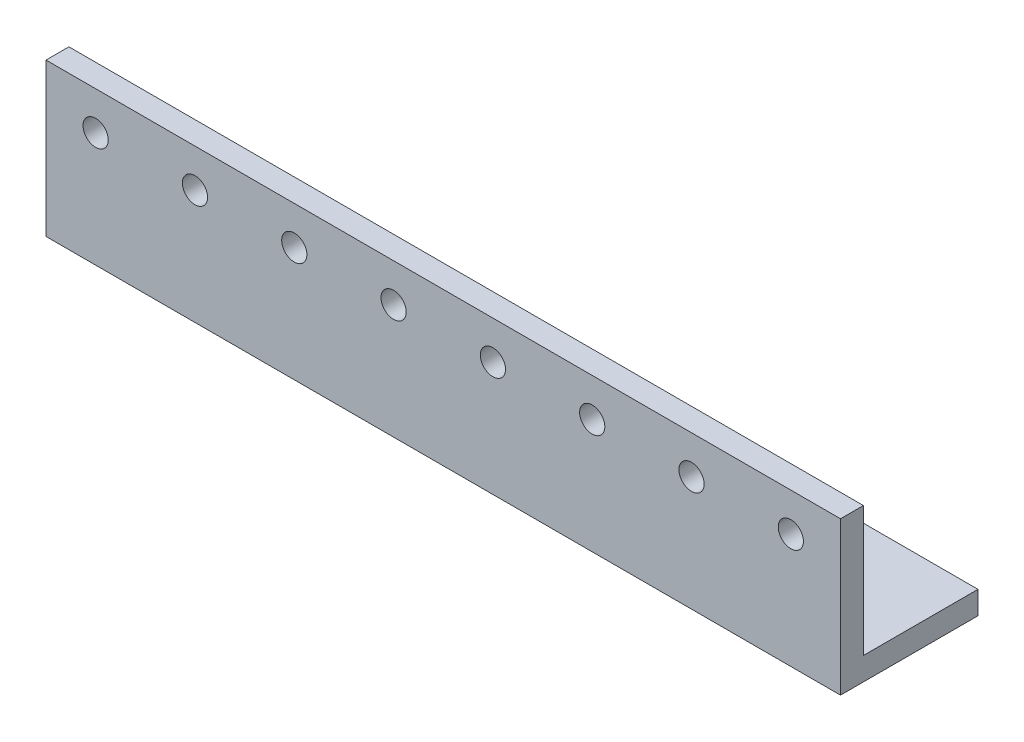
ISO-10303-21;
HEADER;
FILE_DESCRIPTION(('STEP AP214'),'2;1');
FILE_NAME('part.step','',(''),(''),'','','');
FILE_SCHEMA(('AUTOMOTIVE_DESIGN { 1 0 10303 214 1 1 1 1 }'));
ENDSEC;
DATA;
#1=APPLICATION_CONTEXT('core data for automotive mechanical design processes');
#2=APPLICATION_PROTOCOL_DEFINITION('international standard','automotive_design',2000,#1);
#3=PRODUCT_CONTEXT('',#1,'mechanical');
#4=PRODUCT('Part','Part','',(#3));
#5=PRODUCT_RELATED_PRODUCT_CATEGORY('part','',(#4));
#6=PRODUCT_DEFINITION_FORMATION('','',#4);
#7=PRODUCT_DEFINITION_CONTEXT('part definition',#1,'design');
#8=PRODUCT_DEFINITION('design','',#6,#7);
#9=PRODUCT_DEFINITION_SHAPE('','',#8);
#10=(LENGTH_UNIT() NAMED_UNIT(*) SI_UNIT(.MILLI.,.METRE.));
#11=(NAMED_UNIT(*) PLANE_ANGLE_UNIT() SI_UNIT($,.RADIAN.));
#12=(NAMED_UNIT(*) SI_UNIT($,.STERADIAN.) SOLID_ANGLE_UNIT());
#13=UNCERTAINTY_MEASURE_WITH_UNIT(LENGTH_MEASURE(1.E-05),#10,'distance_accuracy_value','');
#14=(GEOMETRIC_REPRESENTATION_CONTEXT(3) GLOBAL_UNCERTAINTY_ASSIGNED_CONTEXT((#13)) GLOBAL_UNIT_ASSIGNED_CONTEXT((#10,
#11,#12)) REPRESENTATION_CONTEXT('',''));
#15=CARTESIAN_POINT('',(0.,0.,0.));
#16=DIRECTION('',(0.,0.,1.));
#17=DIRECTION('',(1.,0.,0.));
#18=AXIS2_PLACEMENT_3D('',#15,#16,#17);
#19=CARTESIAN_POINT('',(52.,-17.,-15.));
#20=DIRECTION('',(0.,-1.,0.));
#21=DIRECTION('',(0.,0.,-1.));
#22=AXIS2_PLACEMENT_3D('',#19,#20,#21);
#23=PLANE('',#22);
#24=CARTESIAN_POINT('',(0.,-17.,-7.5));
#25=DIRECTION('',(0.,1.,0.));
#26=DIRECTION('',(0.,0.,1.));
#27=AXIS2_PLACEMENT_3D('',#24,#25,#26);
#28=CIRCLE('',#27,4.8895);
#29=CARTESIAN_POINT('',(0.,-17.,-2.6105));
#30=VERTEX_POINT('',#29);
#31=EDGE_CURVE('E214',#30,#30,#28,.T.);
#32=ORIENTED_EDGE('',*,*,#31,.F.);
#33=EDGE_LOOP('',(#32));
#34=FACE_BOUND('',#33,.T.);
#35=CARTESIAN_POINT('',(-37.5,-17.,-7.5));
#36=DIRECTION('',(0.,1.,0.));
#37=DIRECTION('',(0.,0.,1.));
#38=AXIS2_PLACEMENT_3D('',#35,#36,#37);
#39=CIRCLE('',#38,4.8895);
#40=CARTESIAN_POINT('',(-37.5,-17.,-2.6105));
#41=VERTEX_POINT('',#40);
#42=EDGE_CURVE('E223',#41,#41,#39,.T.);
#43=ORIENTED_EDGE('',*,*,#42,.F.);
#44=EDGE_LOOP('',(#43));
#45=FACE_BOUND('',#44,.T.);
#46=DIRECTION('',(1.,0.,0.));
#47=VECTOR('',#46,1.);
#48=CARTESIAN_POINT('',(52.,-17.,0.));
#49=LINE('',#48,#47);
#50=CARTESIAN_POINT('',(-52.,-17.,0.));
#51=VERTEX_POINT('',#50);
#52=CARTESIAN_POINT('',(52.,-17.,0.));
#53=VERTEX_POINT('',#52);
#54=EDGE_CURVE('E50',#51,#53,#49,.T.);
#55=ORIENTED_EDGE('',*,*,#54,.T.);
#56=DIRECTION('',(0.,0.,1.));
#57=VECTOR('',#56,1.);
#58=CARTESIAN_POINT('',(52.,-17.,-15.));
#59=LINE('',#58,#57);
#60=CARTESIAN_POINT('',(52.,-17.,-15.));
#61=VERTEX_POINT('',#60);
#62=EDGE_CURVE('E124',#61,#53,#59,.T.);
#63=ORIENTED_EDGE('',*,*,#62,.F.);
#64=DIRECTION('',(1.,0.,0.));
#65=VECTOR('',#64,1.);
#66=CARTESIAN_POINT('',(52.,-17.,-15.));
#67=LINE('',#66,#65);
#68=CARTESIAN_POINT('',(-52.,-17.,-15.));
#69=VERTEX_POINT('',#68);
#70=EDGE_CURVE('E115',#69,#61,#67,.T.);
#71=ORIENTED_EDGE('',*,*,#70,.F.);
#72=DIRECTION('',(0.,0.,1.));
#73=VECTOR('',#72,1.);
#74=CARTESIAN_POINT('',(-52.,-17.,-15.));
#75=LINE('',#74,#73);
#76=EDGE_CURVE('E127',#69,#51,#75,.T.);
#77=ORIENTED_EDGE('',*,*,#76,.T.);
#78=EDGE_LOOP('',(#55,#63,#71,#77));
#79=FACE_BOUND('',#78,.T.);
#80=CARTESIAN_POINT('',(37.5,-17.,-7.5));
#81=DIRECTION('',(0.,1.,0.));
#82=DIRECTION('',(0.,0.,1.));
#83=AXIS2_PLACEMENT_3D('',#80,#81,#82);
#84=CIRCLE('',#83,4.8895);
#85=CARTESIAN_POINT('',(37.5,-17.,-2.6105));
#86=VERTEX_POINT('',#85);
#87=EDGE_CURVE('E204',#86,#86,#84,.T.);
#88=ORIENTED_EDGE('',*,*,#87,.F.);
#89=EDGE_LOOP('',(#88));
#90=FACE_BOUND('',#89,.T.);
#91=ADVANCED_FACE('F35',(#34,#45,#79,#90),#23,.F.);
#92=CARTESIAN_POINT('',(0.,0.,3.));
#93=DIRECTION('',(0.,0.,-1.));
#94=DIRECTION('',(-1.,0.,0.));
#95=AXIS2_PLACEMENT_3D('',#92,#93,#94);
#96=PLANE('',#95);
#97=CARTESIAN_POINT('',(-45.5,-4.99999999999999,3.));
#98=DIRECTION('',(0.,0.,1.));
#99=DIRECTION('',(1.,0.,0.));
#100=AXIS2_PLACEMENT_3D('',#97,#98,#99);
#101=CIRCLE('',#100,1.65);
#102=CARTESIAN_POINT('',(-43.85,-4.99999999999999,3.));
#103=VERTEX_POINT('',#102);
#104=EDGE_CURVE('E130',#103,#103,#101,.T.);
#105=ORIENTED_EDGE('',*,*,#104,.F.);
#106=EDGE_LOOP('',(#105));
#107=FACE_BOUND('',#106,.T.);
#108=CARTESIAN_POINT('',(45.5,-5.00000000000001,3.));
#109=DIRECTION('',(0.,0.,1.));
#110=DIRECTION('',(1.,0.,0.));
#111=AXIS2_PLACEMENT_3D('',#108,#109,#110);
#112=CIRCLE('',#111,1.65);
#113=CARTESIAN_POINT('',(47.15,-5.00000000000001,3.));
#114=VERTEX_POINT('',#113);
#115=EDGE_CURVE('E136',#114,#114,#112,.T.);
#116=ORIENTED_EDGE('',*,*,#115,.F.);
#117=EDGE_LOOP('',(#116));
#118=FACE_BOUND('',#117,.T.);
#119=CARTESIAN_POINT('',(-19.5,-5.,3.));
#120=DIRECTION('',(0.,0.,1.));
#121=DIRECTION('',(1.,0.,0.));
#122=AXIS2_PLACEMENT_3D('',#119,#120,#121);
#123=CIRCLE('',#122,1.65);
#124=CARTESIAN_POINT('',(-17.85,-5.,3.));
#125=VERTEX_POINT('',#124);
#126=EDGE_CURVE('E148',#125,#125,#123,.T.);
#127=ORIENTED_EDGE('',*,*,#126,.F.);
#128=EDGE_LOOP('',(#127));
#129=FACE_BOUND('',#128,.T.);
#130=CARTESIAN_POINT('',(-6.5,-5.,3.));
#131=DIRECTION('',(0.,0.,1.));
#132=DIRECTION('',(1.,0.,0.));
#133=AXIS2_PLACEMENT_3D('',#130,#131,#132);
#134=CIRCLE('',#133,1.65);
#135=CARTESIAN_POINT('',(-4.85,-5.,3.));
#136=VERTEX_POINT('',#135);
#137=EDGE_CURVE('E154',#136,#136,#134,.T.);
#138=ORIENTED_EDGE('',*,*,#137,.F.);
#139=EDGE_LOOP('',(#138));
#140=FACE_BOUND('',#139,.T.);
#141=CARTESIAN_POINT('',(6.5,-5.,3.));
#142=DIRECTION('',(0.,0.,1.));
#143=DIRECTION('',(1.,0.,0.));
#144=AXIS2_PLACEMENT_3D('',#141,#142,#143);
#145=CIRCLE('',#144,1.65);
#146=CARTESIAN_POINT('',(8.15,-5.,3.));
#147=VERTEX_POINT('',#146);
#148=EDGE_CURVE('E160',#147,#147,#145,.T.);
#149=ORIENTED_EDGE('',*,*,#148,.F.);
#150=EDGE_LOOP('',(#149));
#151=FACE_BOUND('',#150,.T.);
#152=CARTESIAN_POINT('',(19.5,-5.,3.));
#153=DIRECTION('',(0.,0.,1.));
#154=DIRECTION('',(1.,0.,0.));
#155=AXIS2_PLACEMENT_3D('',#152,#153,#154);
#156=CIRCLE('',#155,1.65);
#157=CARTESIAN_POINT('',(21.15,-5.,3.));
#158=VERTEX_POINT('',#157);
#159=EDGE_CURVE('E166',#158,#158,#156,.T.);
#160=ORIENTED_EDGE('',*,*,#159,.F.);
#161=EDGE_LOOP('',(#160));
#162=FACE_BOUND('',#161,.T.);
#163=CARTESIAN_POINT('',(32.5,-5.00000000000001,3.));
#164=DIRECTION('',(0.,0.,1.));
#165=DIRECTION('',(1.,0.,0.));
#166=AXIS2_PLACEMENT_3D('',#163,#164,#165);
#167=CIRCLE('',#166,1.65);
#168=CARTESIAN_POINT('',(34.15,-5.00000000000001,3.));
#169=VERTEX_POINT('',#168);
#170=EDGE_CURVE('E172',#169,#169,#167,.T.);
#171=ORIENTED_EDGE('',*,*,#170,.F.);
#172=EDGE_LOOP('',(#171));
#173=FACE_BOUND('',#172,.T.);
#174=DIRECTION('',(0.,-1.,0.));
#175=VECTOR('',#174,1.);
#176=CARTESIAN_POINT('',(-52.,-20.,3.));
#177=LINE('',#176,#175);
#178=CARTESIAN_POINT('',(-52.,0.,3.));
#179=VERTEX_POINT('',#178);
#180=CARTESIAN_POINT('',(-52.,-20.,3.));
#181=VERTEX_POINT('',#180);
#182=EDGE_CURVE('E179',#179,#181,#177,.T.);
#183=ORIENTED_EDGE('',*,*,#182,.T.);
#184=DIRECTION('',(1.,0.,0.));
#185=VECTOR('',#184,1.);
#186=CARTESIAN_POINT('',(-52.,-20.,3.));
#187=LINE('',#186,#185);
#188=CARTESIAN_POINT('',(52.,-20.,3.));
#189=VERTEX_POINT('',#188);
#190=EDGE_CURVE('E81',#181,#189,#187,.T.);
#191=ORIENTED_EDGE('',*,*,#190,.T.);
#192=DIRECTION('',(0.,1.,0.));
#193=VECTOR('',#192,1.);
#194=CARTESIAN_POINT('',(52.,-20.,3.));
#195=LINE('',#194,#193);
#196=CARTESIAN_POINT('',(52.,0.,3.));
#197=VERTEX_POINT('',#196);
#198=EDGE_CURVE('E103',#189,#197,#195,.T.);
#199=ORIENTED_EDGE('',*,*,#198,.T.);
#200=DIRECTION('',(-1.,0.,0.));
#201=VECTOR('',#200,1.);
#202=CARTESIAN_POINT('',(-52.,0.,3.));
#203=LINE('',#202,#201);
#204=EDGE_CURVE('E59',#197,#179,#203,.T.);
#205=ORIENTED_EDGE('',*,*,#204,.T.);
#206=EDGE_LOOP('',(#183,#191,#199,#205));
#207=FACE_BOUND('',#206,.T.);
#208=CARTESIAN_POINT('',(-32.5,-4.99999999999999,3.));
#209=DIRECTION('',(0.,0.,1.));
#210=DIRECTION('',(1.,0.,0.));
#211=AXIS2_PLACEMENT_3D('',#208,#209,#210);
#212=CIRCLE('',#211,1.65);
#213=CARTESIAN_POINT('',(-30.85,-4.99999999999999,3.));
#214=VERTEX_POINT('',#213);
#215=EDGE_CURVE('E142',#214,#214,#212,.T.);
#216=ORIENTED_EDGE('',*,*,#215,.F.);
#217=EDGE_LOOP('',(#216));
#218=FACE_BOUND('',#217,.T.);
#219=ADVANCED_FACE('F199',(#107,#118,#129,#140,#151,#162,#173,#207,#218),#96,.F.);
#220=CARTESIAN_POINT('',(0.,0.,0.));
#221=DIRECTION('',(0.,0.,-1.));
#222=DIRECTION('',(-1.,0.,0.));
#223=AXIS2_PLACEMENT_3D('',#220,#221,#222);
#224=PLANE('',#223);
#225=ORIENTED_EDGE('',*,*,#54,.F.);
#226=DIRECTION('',(0.,-1.,0.));
#227=VECTOR('',#226,1.);
#228=CARTESIAN_POINT('',(-52.,-20.,0.));
#229=LINE('',#228,#227);
#230=CARTESIAN_POINT('',(-52.,0.,0.));
#231=VERTEX_POINT('',#230);
#232=EDGE_CURVE('E178',#231,#51,#229,.T.);
#233=ORIENTED_EDGE('',*,*,#232,.F.);
#234=DIRECTION('',(-1.,0.,0.));
#235=VECTOR('',#234,1.);
#236=CARTESIAN_POINT('',(-52.,0.,0.));
#237=LINE('',#236,#235);
#238=CARTESIAN_POINT('',(52.,0.,0.));
#239=VERTEX_POINT('',#238);
#240=EDGE_CURVE('E74',#239,#231,#237,.T.);
#241=ORIENTED_EDGE('',*,*,#240,.F.);
#242=DIRECTION('',(0.,1.,0.));
#243=VECTOR('',#242,1.);
#244=CARTESIAN_POINT('',(52.,-20.,0.));
#245=LINE('',#244,#243);
#246=EDGE_CURVE('E186',#53,#239,#245,.T.);
#247=ORIENTED_EDGE('',*,*,#246,.F.);
#248=EDGE_LOOP('',(#225,#233,#241,#247));
#249=FACE_BOUND('',#248,.T.);
#250=CARTESIAN_POINT('',(-45.5,-4.99999999999999,0.));
#251=DIRECTION('',(0.,0.,1.));
#252=DIRECTION('',(1.,0.,0.));
#253=AXIS2_PLACEMENT_3D('',#250,#251,#252);
#254=CIRCLE('',#253,1.65);
#255=CARTESIAN_POINT('',(-43.85,-4.99999999999999,0.));
#256=VERTEX_POINT('',#255);
#257=EDGE_CURVE('E133',#256,#256,#254,.T.);
#258=ORIENTED_EDGE('',*,*,#257,.T.);
#259=EDGE_LOOP('',(#258));
#260=FACE_BOUND('',#259,.T.);
#261=CARTESIAN_POINT('',(45.5,-5.00000000000001,0.));
#262=DIRECTION('',(0.,0.,1.));
#263=DIRECTION('',(1.,0.,0.));
#264=AXIS2_PLACEMENT_3D('',#261,#262,#263);
#265=CIRCLE('',#264,1.65);
#266=CARTESIAN_POINT('',(47.15,-5.00000000000001,0.));
#267=VERTEX_POINT('',#266);
#268=EDGE_CURVE('E139',#267,#267,#265,.T.);
#269=ORIENTED_EDGE('',*,*,#268,.T.);
#270=EDGE_LOOP('',(#269));
#271=FACE_BOUND('',#270,.T.);
#272=CARTESIAN_POINT('',(-32.5,-4.99999999999999,0.));
#273=DIRECTION('',(0.,0.,1.));
#274=DIRECTION('',(1.,0.,0.));
#275=AXIS2_PLACEMENT_3D('',#272,#273,#274);
#276=CIRCLE('',#275,1.65);
#277=CARTESIAN_POINT('',(-30.85,-4.99999999999999,0.));
#278=VERTEX_POINT('',#277);
#279=EDGE_CURVE('E145',#278,#278,#276,.T.);
#280=ORIENTED_EDGE('',*,*,#279,.T.);
#281=EDGE_LOOP('',(#280));
#282=FACE_BOUND('',#281,.T.);
#283=CARTESIAN_POINT('',(-19.5,-5.,0.));
#284=DIRECTION('',(0.,0.,1.));
#285=DIRECTION('',(1.,0.,0.));
#286=AXIS2_PLACEMENT_3D('',#283,#284,#285);
#287=CIRCLE('',#286,1.65);
#288=CARTESIAN_POINT('',(-17.85,-5.,0.));
#289=VERTEX_POINT('',#288);
#290=EDGE_CURVE('E151',#289,#289,#287,.T.);
#291=ORIENTED_EDGE('',*,*,#290,.T.);
#292=EDGE_LOOP('',(#291));
#293=FACE_BOUND('',#292,.T.);
#294=CARTESIAN_POINT('',(32.5,-5.00000000000001,0.));
#295=DIRECTION('',(0.,0.,1.));
#296=DIRECTION('',(1.,0.,0.));
#297=AXIS2_PLACEMENT_3D('',#294,#295,#296);
#298=CIRCLE('',#297,1.65);
#299=CARTESIAN_POINT('',(34.15,-5.00000000000001,0.));
#300=VERTEX_POINT('',#299);
#301=EDGE_CURVE('E175',#300,#300,#298,.T.);
#302=ORIENTED_EDGE('',*,*,#301,.T.);
#303=EDGE_LOOP('',(#302));
#304=FACE_BOUND('',#303,.T.);
#305=CARTESIAN_POINT('',(19.5,-5.,0.));
#306=DIRECTION('',(0.,0.,1.));
#307=DIRECTION('',(1.,0.,0.));
#308=AXIS2_PLACEMENT_3D('',#305,#306,#307);
#309=CIRCLE('',#308,1.65);
#310=CARTESIAN_POINT('',(21.15,-5.,0.));
#311=VERTEX_POINT('',#310);
#312=EDGE_CURVE('E169',#311,#311,#309,.T.);
#313=ORIENTED_EDGE('',*,*,#312,.T.);
#314=EDGE_LOOP('',(#313));
#315=FACE_BOUND('',#314,.T.);
#316=CARTESIAN_POINT('',(6.5,-5.,0.));
#317=DIRECTION('',(0.,0.,1.));
#318=DIRECTION('',(1.,0.,0.));
#319=AXIS2_PLACEMENT_3D('',#316,#317,#318);
#320=CIRCLE('',#319,1.65);
#321=CARTESIAN_POINT('',(8.15,-5.,0.));
#322=VERTEX_POINT('',#321);
#323=EDGE_CURVE('E163',#322,#322,#320,.T.);
#324=ORIENTED_EDGE('',*,*,#323,.T.);
#325=EDGE_LOOP('',(#324));
#326=FACE_BOUND('',#325,.T.);
#327=CARTESIAN_POINT('',(-6.5,-5.,0.));
#328=DIRECTION('',(0.,0.,1.));
#329=DIRECTION('',(1.,0.,0.));
#330=AXIS2_PLACEMENT_3D('',#327,#328,#329);
#331=CIRCLE('',#330,1.65);
#332=CARTESIAN_POINT('',(-4.85,-5.,0.));
#333=VERTEX_POINT('',#332);
#334=EDGE_CURVE('E157',#333,#333,#331,.T.);
#335=ORIENTED_EDGE('',*,*,#334,.T.);
#336=EDGE_LOOP('',(#335));
#337=FACE_BOUND('',#336,.T.);
#338=ADVANCED_FACE('F191',(#249,#260,#271,#282,#293,#304,#315,#326,#337),#224,.T.);
#339=CARTESIAN_POINT('',(-52.,-20.,3.));
#340=DIRECTION('',(1.,0.,0.));
#341=DIRECTION('',(0.,0.,-1.));
#342=AXIS2_PLACEMENT_3D('',#339,#340,#341);
#343=PLANE('',#342);
#344=ORIENTED_EDGE('',*,*,#232,.T.);
#345=ORIENTED_EDGE('',*,*,#76,.F.);
#346=DIRECTION('',(0.,1.,0.));
#347=VECTOR('',#346,1.);
#348=CARTESIAN_POINT('',(-52.,-20.,-15.));
#349=LINE('',#348,#347);
#350=CARTESIAN_POINT('',(-52.,-20.,-15.));
#351=VERTEX_POINT('',#350);
#352=EDGE_CURVE('E111',#351,#69,#349,.T.);
#353=ORIENTED_EDGE('',*,*,#352,.F.);
#354=DIRECTION('',(0.,0.,-1.));
#355=VECTOR('',#354,1.);
#356=CARTESIAN_POINT('',(-52.,-20.,3.));
#357=LINE('',#356,#355);
#358=EDGE_CURVE('E11',#181,#351,#357,.T.);
#359=ORIENTED_EDGE('',*,*,#358,.F.);
#360=ORIENTED_EDGE('',*,*,#182,.F.);
#361=DIRECTION('',(0.,0.,-1.));
#362=VECTOR('',#361,1.);
#363=CARTESIAN_POINT('',(-52.,0.,3.));
#364=LINE('',#363,#362);
#365=EDGE_CURVE('E184',#179,#231,#364,.T.);
#366=ORIENTED_EDGE('',*,*,#365,.T.);
#367=EDGE_LOOP('',(#344,#345,#353,#359,#360,#366));
#368=FACE_BOUND('',#367,.T.);
#369=ADVANCED_FACE('F37',(#368),#343,.F.);
#370=CARTESIAN_POINT('',(-52.,-20.,3.));
#371=DIRECTION('',(0.,1.,0.));
#372=DIRECTION('',(0.,0.,1.));
#373=AXIS2_PLACEMENT_3D('',#370,#371,#372);
#374=PLANE('',#373);
#375=CARTESIAN_POINT('',(37.5,-20.,-7.5));
#376=DIRECTION('',(0.,1.,0.));
#377=DIRECTION('',(0.,0.,1.));
#378=AXIS2_PLACEMENT_3D('',#375,#376,#377);
#379=CIRCLE('',#378,2.5527);
#380=CARTESIAN_POINT('',(37.5,-20.,-4.9473));
#381=VERTEX_POINT('',#380);
#382=EDGE_CURVE('E209',#381,#381,#379,.T.);
#383=ORIENTED_EDGE('',*,*,#382,.T.);
#384=EDGE_LOOP('',(#383));
#385=FACE_BOUND('',#384,.T.);
#386=CARTESIAN_POINT('',(0.,-20.,-7.5));
#387=DIRECTION('',(0.,1.,0.));
#388=DIRECTION('',(0.,0.,1.));
#389=AXIS2_PLACEMENT_3D('',#386,#387,#388);
#390=CIRCLE('',#389,2.5527);
#391=CARTESIAN_POINT('',(0.,-20.,-4.9473));
#392=VERTEX_POINT('',#391);
#393=EDGE_CURVE('E220',#392,#392,#390,.T.);
#394=ORIENTED_EDGE('',*,*,#393,.T.);
#395=EDGE_LOOP('',(#394));
#396=FACE_BOUND('',#395,.T.);
#397=CARTESIAN_POINT('',(-37.5,-20.,-7.5));
#398=DIRECTION('',(0.,1.,0.));
#399=DIRECTION('',(0.,0.,1.));
#400=AXIS2_PLACEMENT_3D('',#397,#398,#399);
#401=CIRCLE('',#400,2.5527);
#402=CARTESIAN_POINT('',(-37.5,-20.,-4.9473));
#403=VERTEX_POINT('',#402);
#404=EDGE_CURVE('E118',#403,#403,#401,.T.);
#405=ORIENTED_EDGE('',*,*,#404,.T.);
#406=EDGE_LOOP('',(#405));
#407=FACE_BOUND('',#406,.T.);
#408=ORIENTED_EDGE('',*,*,#358,.T.);
#409=DIRECTION('',(-1.,0.,0.));
#410=VECTOR('',#409,1.);
#411=CARTESIAN_POINT('',(52.,-20.,-15.));
#412=LINE('',#411,#410);
#413=CARTESIAN_POINT('',(52.,-20.,-15.));
#414=VERTEX_POINT('',#413);
#415=EDGE_CURVE('E106',#414,#351,#412,.T.);
#416=ORIENTED_EDGE('',*,*,#415,.F.);
#417=DIRECTION('',(0.,0.,-1.));
#418=VECTOR('',#417,1.);
#419=CARTESIAN_POINT('',(52.,-20.,3.));
#420=LINE('',#419,#418);
#421=EDGE_CURVE('E43',#189,#414,#420,.T.);
#422=ORIENTED_EDGE('',*,*,#421,.F.);
#423=ORIENTED_EDGE('',*,*,#190,.F.);
#424=EDGE_LOOP('',(#408,#416,#422,#423));
#425=FACE_BOUND('',#424,.T.);
#426=ADVANCED_FACE('F107',(#385,#396,#407,#425),#374,.F.);
#427=CARTESIAN_POINT('',(52.,-20.,3.));
#428=DIRECTION('',(-1.,0.,0.));
#429=DIRECTION('',(0.,0.,1.));
#430=AXIS2_PLACEMENT_3D('',#427,#428,#429);
#431=PLANE('',#430);
#432=ORIENTED_EDGE('',*,*,#421,.T.);
#433=DIRECTION('',(0.,-1.,0.));
#434=VECTOR('',#433,1.);
#435=CARTESIAN_POINT('',(52.,-20.,-15.));
#436=LINE('',#435,#434);
#437=EDGE_CURVE('E101',#61,#414,#436,.T.);
#438=ORIENTED_EDGE('',*,*,#437,.F.);
#439=ORIENTED_EDGE('',*,*,#62,.T.);
#440=ORIENTED_EDGE('',*,*,#246,.T.);
#441=DIRECTION('',(0.,0.,-1.));
#442=VECTOR('',#441,1.);
#443=CARTESIAN_POINT('',(52.,0.,3.));
#444=LINE('',#443,#442);
#445=EDGE_CURVE('E104',#197,#239,#444,.T.);
#446=ORIENTED_EDGE('',*,*,#445,.F.);
#447=ORIENTED_EDGE('',*,*,#198,.F.);
#448=EDGE_LOOP('',(#432,#438,#439,#440,#446,#447));
#449=FACE_BOUND('',#448,.T.);
#450=ADVANCED_FACE('F98',(#449),#431,.F.);
#451=CARTESIAN_POINT('',(-52.,0.,3.));
#452=DIRECTION('',(0.,-1.,0.));
#453=DIRECTION('',(0.,0.,-1.));
#454=AXIS2_PLACEMENT_3D('',#451,#452,#453);
#455=PLANE('',#454);
#456=ORIENTED_EDGE('',*,*,#240,.T.);
#457=ORIENTED_EDGE('',*,*,#365,.F.);
#458=ORIENTED_EDGE('',*,*,#204,.F.);
#459=ORIENTED_EDGE('',*,*,#445,.T.);
#460=EDGE_LOOP('',(#456,#457,#458,#459));
#461=FACE_BOUND('',#460,.T.);
#462=ADVANCED_FACE('F190',(#461),#455,.F.);
#463=CARTESIAN_POINT('',(32.5,-5.00000000000001,3.));
#464=DIRECTION('',(0.,0.,1.));
#465=DIRECTION('',(1.,0.,0.));
#466=AXIS2_PLACEMENT_3D('',#463,#464,#465);
#467=CYLINDRICAL_SURFACE('',#466,1.65);
#468=ORIENTED_EDGE('',*,*,#301,.F.);
#469=EDGE_LOOP('',(#468));
#470=FACE_BOUND('',#469,.T.);
#471=ORIENTED_EDGE('',*,*,#170,.T.);
#472=EDGE_LOOP('',(#471));
#473=FACE_BOUND('',#472,.T.);
#474=ADVANCED_FACE('F274',(#470,#473),#467,.F.);
#475=CARTESIAN_POINT('',(19.5,-5.,3.));
#476=DIRECTION('',(0.,0.,1.));
#477=DIRECTION('',(1.,0.,0.));
#478=AXIS2_PLACEMENT_3D('',#475,#476,#477);
#479=CYLINDRICAL_SURFACE('',#478,1.65);
#480=ORIENTED_EDGE('',*,*,#312,.F.);
#481=EDGE_LOOP('',(#480));
#482=FACE_BOUND('',#481,.T.);
#483=ORIENTED_EDGE('',*,*,#159,.T.);
#484=EDGE_LOOP('',(#483));
#485=FACE_BOUND('',#484,.T.);
#486=ADVANCED_FACE('F270',(#482,#485),#479,.F.);
#487=CARTESIAN_POINT('',(6.5,-5.,3.));
#488=DIRECTION('',(0.,0.,1.));
#489=DIRECTION('',(1.,0.,0.));
#490=AXIS2_PLACEMENT_3D('',#487,#488,#489);
#491=CYLINDRICAL_SURFACE('',#490,1.65);
#492=ORIENTED_EDGE('',*,*,#323,.F.);
#493=EDGE_LOOP('',(#492));
#494=FACE_BOUND('',#493,.T.);
#495=ORIENTED_EDGE('',*,*,#148,.T.);
#496=EDGE_LOOP('',(#495));
#497=FACE_BOUND('',#496,.T.);
#498=ADVANCED_FACE('F266',(#494,#497),#491,.F.);
#499=CARTESIAN_POINT('',(-6.5,-5.,3.));
#500=DIRECTION('',(0.,0.,1.));
#501=DIRECTION('',(1.,0.,0.));
#502=AXIS2_PLACEMENT_3D('',#499,#500,#501);
#503=CYLINDRICAL_SURFACE('',#502,1.65);
#504=ORIENTED_EDGE('',*,*,#334,.F.);
#505=EDGE_LOOP('',(#504));
#506=FACE_BOUND('',#505,.T.);
#507=ORIENTED_EDGE('',*,*,#137,.T.);
#508=EDGE_LOOP('',(#507));
#509=FACE_BOUND('',#508,.T.);
#510=ADVANCED_FACE('F262',(#506,#509),#503,.F.);
#511=CARTESIAN_POINT('',(-19.5,-5.,3.));
#512=DIRECTION('',(0.,0.,1.));
#513=DIRECTION('',(1.,0.,0.));
#514=AXIS2_PLACEMENT_3D('',#511,#512,#513);
#515=CYLINDRICAL_SURFACE('',#514,1.65);
#516=ORIENTED_EDGE('',*,*,#290,.F.);
#517=EDGE_LOOP('',(#516));
#518=FACE_BOUND('',#517,.T.);
#519=ORIENTED_EDGE('',*,*,#126,.T.);
#520=EDGE_LOOP('',(#519));
#521=FACE_BOUND('',#520,.T.);
#522=ADVANCED_FACE('F258',(#518,#521),#515,.F.);
#523=CARTESIAN_POINT('',(-32.5,-4.99999999999999,3.));
#524=DIRECTION('',(0.,0.,1.));
#525=DIRECTION('',(1.,0.,0.));
#526=AXIS2_PLACEMENT_3D('',#523,#524,#525);
#527=CYLINDRICAL_SURFACE('',#526,1.65);
#528=ORIENTED_EDGE('',*,*,#279,.F.);
#529=EDGE_LOOP('',(#528));
#530=FACE_BOUND('',#529,.T.);
#531=ORIENTED_EDGE('',*,*,#215,.T.);
#532=EDGE_LOOP('',(#531));
#533=FACE_BOUND('',#532,.T.);
#534=ADVANCED_FACE('F254',(#530,#533),#527,.F.);
#535=CARTESIAN_POINT('',(45.5,-5.00000000000001,3.));
#536=DIRECTION('',(0.,0.,1.));
#537=DIRECTION('',(1.,0.,0.));
#538=AXIS2_PLACEMENT_3D('',#535,#536,#537);
#539=CYLINDRICAL_SURFACE('',#538,1.65);
#540=ORIENTED_EDGE('',*,*,#268,.F.);
#541=EDGE_LOOP('',(#540));
#542=FACE_BOUND('',#541,.T.);
#543=ORIENTED_EDGE('',*,*,#115,.T.);
#544=EDGE_LOOP('',(#543));
#545=FACE_BOUND('',#544,.T.);
#546=ADVANCED_FACE('F250',(#542,#545),#539,.F.);
#547=CARTESIAN_POINT('',(-45.5,-4.99999999999999,3.));
#548=DIRECTION('',(0.,0.,1.));
#549=DIRECTION('',(1.,0.,0.));
#550=AXIS2_PLACEMENT_3D('',#547,#548,#549);
#551=CYLINDRICAL_SURFACE('',#550,1.65);
#552=ORIENTED_EDGE('',*,*,#257,.F.);
#553=EDGE_LOOP('',(#552));
#554=FACE_BOUND('',#553,.T.);
#555=ORIENTED_EDGE('',*,*,#104,.T.);
#556=EDGE_LOOP('',(#555));
#557=FACE_BOUND('',#556,.T.);
#558=ADVANCED_FACE('F244',(#554,#557),#551,.F.);
#559=CARTESIAN_POINT('',(0.,0.,-15.));
#560=DIRECTION('',(0.,0.,1.));
#561=DIRECTION('',(1.,0.,0.));
#562=AXIS2_PLACEMENT_3D('',#559,#560,#561);
#563=PLANE('',#562);
#564=ORIENTED_EDGE('',*,*,#437,.T.);
#565=ORIENTED_EDGE('',*,*,#415,.T.);
#566=ORIENTED_EDGE('',*,*,#352,.T.);
#567=ORIENTED_EDGE('',*,*,#70,.T.);
#568=EDGE_LOOP('',(#564,#565,#566,#567));
#569=FACE_BOUND('',#568,.T.);
#570=ADVANCED_FACE('F113',(#569),#563,.F.);
#571=CARTESIAN_POINT('',(-37.5,-17.,-7.5));
#572=DIRECTION('',(0.,1.,0.));
#573=DIRECTION('',(0.,0.,1.));
#574=AXIS2_PLACEMENT_3D('',#571,#572,#573);
#575=CYLINDRICAL_SURFACE('',#574,2.5527);
#576=ORIENTED_EDGE('',*,*,#404,.F.);
#577=EDGE_LOOP('',(#576));
#578=FACE_BOUND('',#577,.T.);
#579=CARTESIAN_POINT('',(-37.5,-18.9608080181351,-7.5));
#580=DIRECTION('',(0.,1.,0.));
#581=DIRECTION('',(0.,0.,1.));
#582=AXIS2_PLACEMENT_3D('',#579,#580,#581);
#583=CIRCLE('',#582,2.5527);
#584=CARTESIAN_POINT('',(-37.5,-18.9608080181351,-4.9473));
#585=VERTEX_POINT('',#584);
#586=EDGE_CURVE('E225',#585,#585,#583,.T.);
#587=ORIENTED_EDGE('',*,*,#586,.T.);
#588=EDGE_LOOP('',(#587));
#589=FACE_BOUND('',#588,.T.);
#590=ADVANCED_FACE('F233',(#578,#589),#575,.F.);
#591=CARTESIAN_POINT('',(-37.5,-17.,-7.5));
#592=DIRECTION('',(0.,1.,0.));
#593=DIRECTION('',(0.,0.,1.));
#594=AXIS2_PLACEMENT_3D('',#591,#592,#593);
#595=CONICAL_SURFACE('',#594,4.8895,0.872664625997164);
#596=ORIENTED_EDGE('',*,*,#586,.F.);
#597=EDGE_LOOP('',(#596));
#598=FACE_BOUND('',#597,.T.);
#599=ORIENTED_EDGE('',*,*,#42,.T.);
#600=EDGE_LOOP('',(#599));
#601=FACE_BOUND('',#600,.T.);
#602=ADVANCED_FACE('F235',(#598,#601),#595,.F.);
#603=CARTESIAN_POINT('',(0.,-17.,-7.5));
#604=DIRECTION('',(0.,1.,0.));
#605=DIRECTION('',(0.,0.,1.));
#606=AXIS2_PLACEMENT_3D('',#603,#604,#605);
#607=CYLINDRICAL_SURFACE('',#606,2.5527);
#608=ORIENTED_EDGE('',*,*,#393,.F.);
#609=EDGE_LOOP('',(#608));
#610=FACE_BOUND('',#609,.T.);
#611=CARTESIAN_POINT('',(0.,-18.9608080181351,-7.5));
#612=DIRECTION('',(0.,1.,0.));
#613=DIRECTION('',(0.,0.,1.));
#614=AXIS2_PLACEMENT_3D('',#611,#612,#613);
#615=CIRCLE('',#614,2.5527);
#616=CARTESIAN_POINT('',(0.,-18.9608080181351,-4.9473));
#617=VERTEX_POINT('',#616);
#618=EDGE_CURVE('E217',#617,#617,#615,.T.);
#619=ORIENTED_EDGE('',*,*,#618,.T.);
#620=EDGE_LOOP('',(#619));
#621=FACE_BOUND('',#620,.T.);
#622=ADVANCED_FACE('F241',(#610,#621),#607,.F.);
#623=CARTESIAN_POINT('',(0.,-17.,-7.5));
#624=DIRECTION('',(0.,1.,0.));
#625=DIRECTION('',(0.,0.,1.));
#626=AXIS2_PLACEMENT_3D('',#623,#624,#625);
#627=CONICAL_SURFACE('',#626,4.8895,0.872664625997164);
#628=ORIENTED_EDGE('',*,*,#618,.F.);
#629=EDGE_LOOP('',(#628));
#630=FACE_BOUND('',#629,.T.);
#631=ORIENTED_EDGE('',*,*,#31,.T.);
#632=EDGE_LOOP('',(#631));
#633=FACE_BOUND('',#632,.T.);
#634=ADVANCED_FACE('F298',(#630,#633),#627,.F.);
#635=CARTESIAN_POINT('',(37.5,-17.,-7.5));
#636=DIRECTION('',(0.,1.,0.));
#637=DIRECTION('',(0.,0.,1.));
#638=AXIS2_PLACEMENT_3D('',#635,#636,#637);
#639=CYLINDRICAL_SURFACE('',#638,2.5527);
#640=ORIENTED_EDGE('',*,*,#382,.F.);
#641=EDGE_LOOP('',(#640));
#642=FACE_BOUND('',#641,.T.);
#643=CARTESIAN_POINT('',(37.5,-18.9608080181351,-7.5));
#644=DIRECTION('',(0.,1.,0.));
#645=DIRECTION('',(0.,0.,1.));
#646=AXIS2_PLACEMENT_3D('',#643,#644,#645);
#647=CIRCLE('',#646,2.5527);
#648=CARTESIAN_POINT('',(37.5,-18.9608080181351,-4.9473));
#649=VERTEX_POINT('',#648);
#650=EDGE_CURVE('E206',#649,#649,#647,.T.);
#651=ORIENTED_EDGE('',*,*,#650,.T.);
#652=EDGE_LOOP('',(#651));
#653=FACE_BOUND('',#652,.T.);
#654=ADVANCED_FACE('F303',(#642,#653),#639,.F.);
#655=CARTESIAN_POINT('',(37.5,-17.,-7.5));
#656=DIRECTION('',(0.,1.,0.));
#657=DIRECTION('',(0.,0.,1.));
#658=AXIS2_PLACEMENT_3D('',#655,#656,#657);
#659=CONICAL_SURFACE('',#658,4.8895,0.872664625997164);
#660=ORIENTED_EDGE('',*,*,#650,.F.);
#661=EDGE_LOOP('',(#660));
#662=FACE_BOUND('',#661,.T.);
#663=ORIENTED_EDGE('',*,*,#87,.T.);
#664=EDGE_LOOP('',(#663));
#665=FACE_BOUND('',#664,.T.);
#666=ADVANCED_FACE('F312',(#662,#665),#659,.F.);
#667=CLOSED_SHELL('',(#91,#219,#338,#369,#426,#450,#462,#474,#486,#498,#510,#522,#534,#546,#558,
#570,#590,#602,#622,#634,#654,#666));
#668=MANIFOLD_SOLID_BREP('B2',#667);
#669=ADVANCED_BREP_SHAPE_REPRESENTATION('',(#18,#668),#14);
#670=SHAPE_DEFINITION_REPRESENTATION(#9,#669);
ENDSEC;
END-ISO-10303-21;
